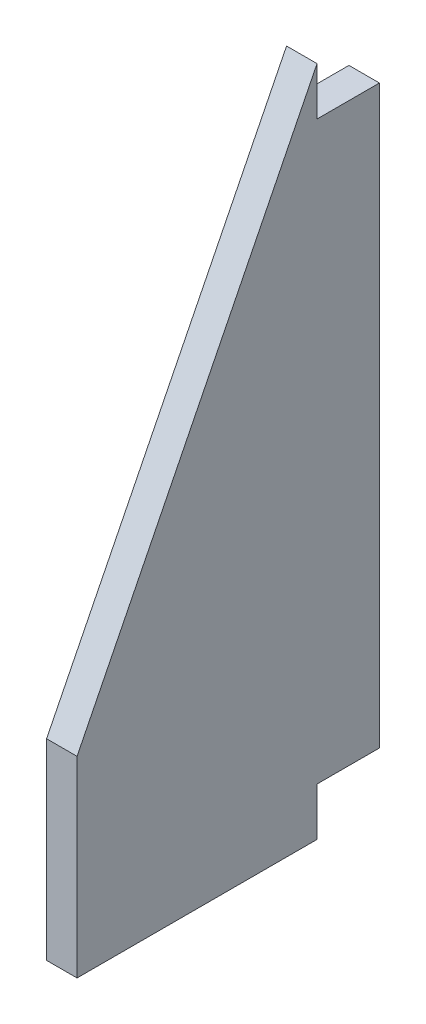
ISO-10303-21;
HEADER;
FILE_DESCRIPTION(('STEP AP214'),'2;1');
FILE_NAME('part.step','',(''),(''),'','','');
FILE_SCHEMA(('AUTOMOTIVE_DESIGN { 1 0 10303 214 1 1 1 1 }'));
ENDSEC;
DATA;
#1=APPLICATION_CONTEXT('core data for automotive mechanical design processes');
#2=APPLICATION_PROTOCOL_DEFINITION('international standard','automotive_design',2000,#1);
#3=PRODUCT_CONTEXT('',#1,'mechanical');
#4=PRODUCT('Part','Part','',(#3));
#5=PRODUCT_RELATED_PRODUCT_CATEGORY('part','',(#4));
#6=PRODUCT_DEFINITION_FORMATION('','',#4);
#7=PRODUCT_DEFINITION_CONTEXT('part definition',#1,'design');
#8=PRODUCT_DEFINITION('design','',#6,#7);
#9=PRODUCT_DEFINITION_SHAPE('','',#8);
#10=(LENGTH_UNIT() NAMED_UNIT(*) SI_UNIT(.MILLI.,.METRE.));
#11=(NAMED_UNIT(*) PLANE_ANGLE_UNIT() SI_UNIT($,.RADIAN.));
#12=(NAMED_UNIT(*) SI_UNIT($,.STERADIAN.) SOLID_ANGLE_UNIT());
#13=UNCERTAINTY_MEASURE_WITH_UNIT(LENGTH_MEASURE(1.E-05),#10,'distance_accuracy_value','');
#14=(GEOMETRIC_REPRESENTATION_CONTEXT(3) GLOBAL_UNCERTAINTY_ASSIGNED_CONTEXT((#13)) GLOBAL_UNIT_ASSIGNED_CONTEXT((#10,
#11,#12)) REPRESENTATION_CONTEXT('',''));
#15=CARTESIAN_POINT('',(0.,0.,0.));
#16=DIRECTION('',(0.,0.,1.));
#17=DIRECTION('',(1.,0.,0.));
#18=AXIS2_PLACEMENT_3D('',#15,#16,#17);
#19=CARTESIAN_POINT('',(3.175,10.,34.));
#20=DIRECTION('',(0.,0.,1.));
#21=DIRECTION('',(0.,-1.,0.));
#22=AXIS2_PLACEMENT_3D('',#19,#20,#21);
#23=PLANE('',#22);
#24=DIRECTION('',(0.,1.,0.));
#25=VECTOR('',#24,1.);
#26=CARTESIAN_POINT('',(-3.175,10.,34.));
#27=LINE('',#26,#25);
#28=CARTESIAN_POINT('',(-3.175,0.,34.));
#29=VERTEX_POINT('',#28);
#30=CARTESIAN_POINT('',(-3.175,10.,34.));
#31=VERTEX_POINT('',#30);
#32=EDGE_CURVE('E140',#29,#31,#27,.T.);
#33=ORIENTED_EDGE('',*,*,#32,.T.);
#34=DIRECTION('',(-1.,0.,0.));
#35=VECTOR('',#34,1.);
#36=CARTESIAN_POINT('',(3.175,10.,34.));
#37=LINE('',#36,#35);
#38=CARTESIAN_POINT('',(3.175,10.,34.));
#39=VERTEX_POINT('',#38);
#40=EDGE_CURVE('E11',#39,#31,#37,.T.);
#41=ORIENTED_EDGE('',*,*,#40,.F.);
#42=DIRECTION('',(0.,1.,0.));
#43=VECTOR('',#42,1.);
#44=CARTESIAN_POINT('',(3.175,10.,34.));
#45=LINE('',#44,#43);
#46=CARTESIAN_POINT('',(3.175,0.,34.));
#47=VERTEX_POINT('',#46);
#48=EDGE_CURVE('E162',#47,#39,#45,.T.);
#49=ORIENTED_EDGE('',*,*,#48,.F.);
#50=DIRECTION('',(-1.,0.,0.));
#51=VECTOR('',#50,1.);
#52=CARTESIAN_POINT('',(3.175,0.,34.));
#53=LINE('',#52,#51);
#54=EDGE_CURVE('E136',#47,#29,#53,.T.);
#55=ORIENTED_EDGE('',*,*,#54,.T.);
#56=EDGE_LOOP('',(#33,#41,#49,#55));
#57=FACE_BOUND('',#56,.T.);
#58=ADVANCED_FACE('F39',(#57),#23,.F.);
#59=CARTESIAN_POINT('',(3.175,10.,34.));
#60=DIRECTION('',(0.,1.,0.));
#61=DIRECTION('',(0.,0.,1.));
#62=AXIS2_PLACEMENT_3D('',#59,#60,#61);
#63=PLANE('',#62);
#64=DIRECTION('',(0.,0.,-1.));
#65=VECTOR('',#64,1.);
#66=CARTESIAN_POINT('',(-3.175,10.,34.));
#67=LINE('',#66,#65);
#68=CARTESIAN_POINT('',(-3.175,10.,21.));
#69=VERTEX_POINT('',#68);
#70=EDGE_CURVE('E144',#31,#69,#67,.T.);
#71=ORIENTED_EDGE('',*,*,#70,.T.);
#72=DIRECTION('',(-1.,0.,0.));
#73=VECTOR('',#72,1.);
#74=CARTESIAN_POINT('',(3.175,10.,21.));
#75=LINE('',#74,#73);
#76=CARTESIAN_POINT('',(3.175,10.,21.));
#77=VERTEX_POINT('',#76);
#78=EDGE_CURVE('E48',#77,#69,#75,.T.);
#79=ORIENTED_EDGE('',*,*,#78,.F.);
#80=DIRECTION('',(0.,0.,-1.));
#81=VECTOR('',#80,1.);
#82=CARTESIAN_POINT('',(3.175,10.,34.));
#83=LINE('',#82,#81);
#84=EDGE_CURVE('E99',#39,#77,#83,.T.);
#85=ORIENTED_EDGE('',*,*,#84,.F.);
#86=ORIENTED_EDGE('',*,*,#40,.T.);
#87=EDGE_LOOP('',(#71,#79,#85,#86));
#88=FACE_BOUND('',#87,.T.);
#89=ADVANCED_FACE('F208',(#88),#63,.F.);
#90=CARTESIAN_POINT('',(3.175,10.,21.));
#91=DIRECTION('',(0.,0.,1.));
#92=DIRECTION('',(1.,0.,0.));
#93=AXIS2_PLACEMENT_3D('',#90,#91,#92);
#94=PLANE('',#93);
#95=DIRECTION('',(0.,1.,0.));
#96=VECTOR('',#95,1.);
#97=CARTESIAN_POINT('',(-3.175,10.,21.));
#98=LINE('',#97,#96);
#99=CARTESIAN_POINT('',(-3.175,130.,21.));
#100=VERTEX_POINT('',#99);
#101=EDGE_CURVE('E147',#69,#100,#98,.T.);
#102=ORIENTED_EDGE('',*,*,#101,.T.);
#103=DIRECTION('',(-1.,0.,0.));
#104=VECTOR('',#103,1.);
#105=CARTESIAN_POINT('',(3.175,130.,21.));
#106=LINE('',#105,#104);
#107=CARTESIAN_POINT('',(3.175,130.,21.));
#108=VERTEX_POINT('',#107);
#109=EDGE_CURVE('E173',#108,#100,#106,.T.);
#110=ORIENTED_EDGE('',*,*,#109,.F.);
#111=DIRECTION('',(0.,1.,0.));
#112=VECTOR('',#111,1.);
#113=CARTESIAN_POINT('',(3.175,10.,21.));
#114=LINE('',#113,#112);
#115=EDGE_CURVE('E183',#77,#108,#114,.T.);
#116=ORIENTED_EDGE('',*,*,#115,.F.);
#117=ORIENTED_EDGE('',*,*,#78,.T.);
#118=EDGE_LOOP('',(#102,#110,#116,#117));
#119=FACE_BOUND('',#118,.T.);
#120=ADVANCED_FACE('F181',(#119),#94,.F.);
#121=CARTESIAN_POINT('',(3.175,130.,21.));
#122=DIRECTION('',(0.,-1.,0.));
#123=DIRECTION('',(0.,0.,-1.));
#124=AXIS2_PLACEMENT_3D('',#121,#122,#123);
#125=PLANE('',#124);
#126=DIRECTION('',(0.,0.,1.));
#127=VECTOR('',#126,1.);
#128=CARTESIAN_POINT('',(-3.175,130.,21.));
#129=LINE('',#128,#127);
#130=CARTESIAN_POINT('',(-3.175,130.,34.));
#131=VERTEX_POINT('',#130);
#132=EDGE_CURVE('E150',#100,#131,#129,.T.);
#133=ORIENTED_EDGE('',*,*,#132,.T.);
#134=DIRECTION('',(-1.,0.,0.));
#135=VECTOR('',#134,1.);
#136=CARTESIAN_POINT('',(3.175,130.,34.));
#137=LINE('',#136,#135);
#138=CARTESIAN_POINT('',(3.175,130.,34.));
#139=VERTEX_POINT('',#138);
#140=EDGE_CURVE('E169',#139,#131,#137,.T.);
#141=ORIENTED_EDGE('',*,*,#140,.F.);
#142=DIRECTION('',(0.,0.,1.));
#143=VECTOR('',#142,1.);
#144=CARTESIAN_POINT('',(3.175,130.,21.));
#145=LINE('',#144,#143);
#146=EDGE_CURVE('E196',#108,#139,#145,.T.);
#147=ORIENTED_EDGE('',*,*,#146,.F.);
#148=ORIENTED_EDGE('',*,*,#109,.T.);
#149=EDGE_LOOP('',(#133,#141,#147,#148));
#150=FACE_BOUND('',#149,.T.);
#151=ADVANCED_FACE('F191',(#150),#125,.F.);
#152=CARTESIAN_POINT('',(3.175,140.,34.));
#153=DIRECTION('',(0.,0.,1.));
#154=DIRECTION('',(0.,-1.,0.));
#155=AXIS2_PLACEMENT_3D('',#152,#153,#154);
#156=PLANE('',#155);
#157=DIRECTION('',(0.,1.,0.));
#158=VECTOR('',#157,1.);
#159=CARTESIAN_POINT('',(-3.175,140.,34.));
#160=LINE('',#159,#158);
#161=CARTESIAN_POINT('',(-3.175,140.,34.));
#162=VERTEX_POINT('',#161);
#163=EDGE_CURVE('E153',#131,#162,#160,.T.);
#164=ORIENTED_EDGE('',*,*,#163,.T.);
#165=DIRECTION('',(-1.,0.,0.));
#166=VECTOR('',#165,1.);
#167=CARTESIAN_POINT('',(3.175,140.,34.));
#168=LINE('',#167,#166);
#169=CARTESIAN_POINT('',(3.175,140.,34.));
#170=VERTEX_POINT('',#169);
#171=EDGE_CURVE('E129',#170,#162,#168,.T.);
#172=ORIENTED_EDGE('',*,*,#171,.F.);
#173=DIRECTION('',(0.,1.,0.));
#174=VECTOR('',#173,1.);
#175=CARTESIAN_POINT('',(3.175,140.,34.));
#176=LINE('',#175,#174);
#177=EDGE_CURVE('E118',#139,#170,#176,.T.);
#178=ORIENTED_EDGE('',*,*,#177,.F.);
#179=ORIENTED_EDGE('',*,*,#140,.T.);
#180=EDGE_LOOP('',(#164,#172,#178,#179));
#181=FACE_BOUND('',#180,.T.);
#182=ADVANCED_FACE('F194',(#181),#156,.F.);
#183=CARTESIAN_POINT('',(3.175,40.,84.));
#184=DIRECTION('',(0.,-0.447213595499958,-0.894427190999916));
#185=DIRECTION('',(0.,0.894427190999916,-0.447213595499958));
#186=AXIS2_PLACEMENT_3D('',#183,#184,#185);
#187=PLANE('',#186);
#188=DIRECTION('',(0.,-0.894427190999916,0.447213595499958));
#189=VECTOR('',#188,1.);
#190=CARTESIAN_POINT('',(-3.175,40.,84.));
#191=LINE('',#190,#189);
#192=CARTESIAN_POINT('',(-3.175,40.,84.));
#193=VERTEX_POINT('',#192);
#194=EDGE_CURVE('E127',#162,#193,#191,.T.);
#195=ORIENTED_EDGE('',*,*,#194,.T.);
#196=DIRECTION('',(-1.,0.,0.));
#197=VECTOR('',#196,1.);
#198=CARTESIAN_POINT('',(3.175,40.,84.));
#199=LINE('',#198,#197);
#200=CARTESIAN_POINT('',(3.175,40.,84.));
#201=VERTEX_POINT('',#200);
#202=EDGE_CURVE('E124',#201,#193,#199,.T.);
#203=ORIENTED_EDGE('',*,*,#202,.F.);
#204=DIRECTION('',(0.,-0.894427190999916,0.447213595499958));
#205=VECTOR('',#204,1.);
#206=CARTESIAN_POINT('',(3.175,40.,84.));
#207=LINE('',#206,#205);
#208=EDGE_CURVE('E112',#170,#201,#207,.T.);
#209=ORIENTED_EDGE('',*,*,#208,.F.);
#210=ORIENTED_EDGE('',*,*,#171,.T.);
#211=EDGE_LOOP('',(#195,#203,#209,#210));
#212=FACE_BOUND('',#211,.T.);
#213=ADVANCED_FACE('F125',(#212),#187,.F.);
#214=CARTESIAN_POINT('',(3.175,0.,84.));
#215=DIRECTION('',(0.,0.,-1.));
#216=DIRECTION('',(-1.,0.,0.));
#217=AXIS2_PLACEMENT_3D('',#214,#215,#216);
#218=PLANE('',#217);
#219=DIRECTION('',(0.,-1.,0.));
#220=VECTOR('',#219,1.);
#221=CARTESIAN_POINT('',(-3.175,0.,84.));
#222=LINE('',#221,#220);
#223=CARTESIAN_POINT('',(-3.175,0.,84.));
#224=VERTEX_POINT('',#223);
#225=EDGE_CURVE('E85',#193,#224,#222,.T.);
#226=ORIENTED_EDGE('',*,*,#225,.T.);
#227=DIRECTION('',(-1.,0.,0.));
#228=VECTOR('',#227,1.);
#229=CARTESIAN_POINT('',(3.175,0.,84.));
#230=LINE('',#229,#228);
#231=CARTESIAN_POINT('',(3.175,0.,84.));
#232=VERTEX_POINT('',#231);
#233=EDGE_CURVE('E130',#232,#224,#230,.T.);
#234=ORIENTED_EDGE('',*,*,#233,.F.);
#235=DIRECTION('',(0.,-1.,0.));
#236=VECTOR('',#235,1.);
#237=CARTESIAN_POINT('',(3.175,0.,84.));
#238=LINE('',#237,#236);
#239=EDGE_CURVE('E116',#201,#232,#238,.T.);
#240=ORIENTED_EDGE('',*,*,#239,.F.);
#241=ORIENTED_EDGE('',*,*,#202,.T.);
#242=EDGE_LOOP('',(#226,#234,#240,#241));
#243=FACE_BOUND('',#242,.T.);
#244=ADVANCED_FACE('F132',(#243),#218,.F.);
#245=CARTESIAN_POINT('',(3.175,0.,34.));
#246=DIRECTION('',(0.,1.,0.));
#247=DIRECTION('',(0.,0.,1.));
#248=AXIS2_PLACEMENT_3D('',#245,#246,#247);
#249=PLANE('',#248);
#250=DIRECTION('',(0.,0.,-1.));
#251=VECTOR('',#250,1.);
#252=CARTESIAN_POINT('',(-3.175,0.,34.));
#253=LINE('',#252,#251);
#254=EDGE_CURVE('E91',#224,#29,#253,.T.);
#255=ORIENTED_EDGE('',*,*,#254,.T.);
#256=ORIENTED_EDGE('',*,*,#54,.F.);
#257=DIRECTION('',(0.,0.,-1.));
#258=VECTOR('',#257,1.);
#259=CARTESIAN_POINT('',(3.175,0.,34.));
#260=LINE('',#259,#258);
#261=EDGE_CURVE('E56',#232,#47,#260,.T.);
#262=ORIENTED_EDGE('',*,*,#261,.F.);
#263=ORIENTED_EDGE('',*,*,#233,.T.);
#264=EDGE_LOOP('',(#255,#256,#262,#263));
#265=FACE_BOUND('',#264,.T.);
#266=ADVANCED_FACE('F224',(#265),#249,.F.);
#267=CARTESIAN_POINT('',(3.175,0.,0.));
#268=DIRECTION('',(-1.,0.,0.));
#269=DIRECTION('',(0.,0.,1.));
#270=AXIS2_PLACEMENT_3D('',#267,#268,#269);
#271=PLANE('',#270);
#272=ORIENTED_EDGE('',*,*,#48,.T.);
#273=ORIENTED_EDGE('',*,*,#84,.T.);
#274=ORIENTED_EDGE('',*,*,#115,.T.);
#275=ORIENTED_EDGE('',*,*,#146,.T.);
#276=ORIENTED_EDGE('',*,*,#177,.T.);
#277=ORIENTED_EDGE('',*,*,#208,.T.);
#278=ORIENTED_EDGE('',*,*,#239,.T.);
#279=ORIENTED_EDGE('',*,*,#261,.T.);
#280=EDGE_LOOP('',(#272,#273,#274,#275,#276,#277,#278,#279));
#281=FACE_BOUND('',#280,.T.);
#282=ADVANCED_FACE('F114',(#281),#271,.F.);
#283=CARTESIAN_POINT('',(-3.175,0.,0.));
#284=DIRECTION('',(-1.,0.,0.));
#285=DIRECTION('',(0.,0.,1.));
#286=AXIS2_PLACEMENT_3D('',#283,#284,#285);
#287=PLANE('',#286);
#288=ORIENTED_EDGE('',*,*,#32,.F.);
#289=ORIENTED_EDGE('',*,*,#254,.F.);
#290=ORIENTED_EDGE('',*,*,#225,.F.);
#291=ORIENTED_EDGE('',*,*,#194,.F.);
#292=ORIENTED_EDGE('',*,*,#163,.F.);
#293=ORIENTED_EDGE('',*,*,#132,.F.);
#294=ORIENTED_EDGE('',*,*,#101,.F.);
#295=ORIENTED_EDGE('',*,*,#70,.F.);
#296=EDGE_LOOP('',(#288,#289,#290,#291,#292,#293,#294,#295));
#297=FACE_BOUND('',#296,.T.);
#298=ADVANCED_FACE('F187',(#297),#287,.T.);
#299=CLOSED_SHELL('',(#58,#89,#120,#151,#182,#213,#244,#266,#282,#298));
#300=MANIFOLD_SOLID_BREP('B2',#299);
#301=ADVANCED_BREP_SHAPE_REPRESENTATION('',(#18,#300),#14);
#302=SHAPE_DEFINITION_REPRESENTATION(#9,#301);
ENDSEC;
END-ISO-10303-21;
